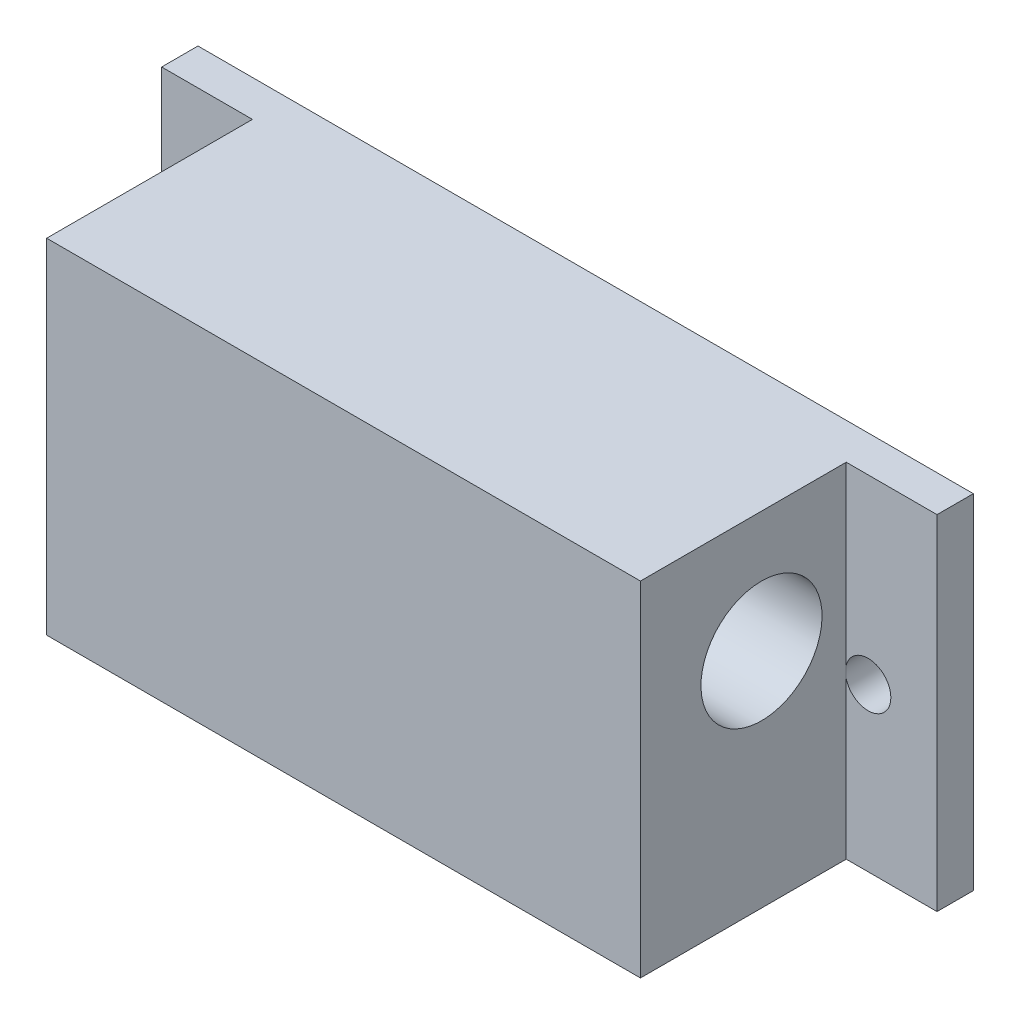
ISO-10303-21;
HEADER;
FILE_DESCRIPTION(('STEP AP214'),'2;1');
FILE_NAME('part.step','',(''),(''),'','','');
FILE_SCHEMA(('AUTOMOTIVE_DESIGN { 1 0 10303 214 1 1 1 1 }'));
ENDSEC;
DATA;
#1=APPLICATION_CONTEXT('core data for automotive mechanical design processes');
#2=APPLICATION_PROTOCOL_DEFINITION('international standard','automotive_design',2000,#1);
#3=PRODUCT_CONTEXT('',#1,'mechanical');
#4=PRODUCT('Part','Part','',(#3));
#5=PRODUCT_RELATED_PRODUCT_CATEGORY('part','',(#4));
#6=PRODUCT_DEFINITION_FORMATION('','',#4);
#7=PRODUCT_DEFINITION_CONTEXT('part definition',#1,'design');
#8=PRODUCT_DEFINITION('design','',#6,#7);
#9=PRODUCT_DEFINITION_SHAPE('','',#8);
#10=(LENGTH_UNIT() NAMED_UNIT(*) SI_UNIT(.MILLI.,.METRE.));
#11=(NAMED_UNIT(*) PLANE_ANGLE_UNIT() SI_UNIT($,.RADIAN.));
#12=(NAMED_UNIT(*) SI_UNIT($,.STERADIAN.) SOLID_ANGLE_UNIT());
#13=UNCERTAINTY_MEASURE_WITH_UNIT(LENGTH_MEASURE(1.E-05),#10,'distance_accuracy_value','');
#14=(GEOMETRIC_REPRESENTATION_CONTEXT(3) GLOBAL_UNCERTAINTY_ASSIGNED_CONTEXT((#13)) GLOBAL_UNIT_ASSIGNED_CONTEXT((#10,
#11,#12)) REPRESENTATION_CONTEXT('',''));
#15=CARTESIAN_POINT('',(0.,0.,0.));
#16=DIRECTION('',(0.,0.,1.));
#17=DIRECTION('',(1.,0.,0.));
#18=AXIS2_PLACEMENT_3D('',#15,#16,#17);
#19=CARTESIAN_POINT('',(35.9108748908686,0.,-4.445));
#20=DIRECTION('',(0.,0.,-1.));
#21=DIRECTION('',(0.,1.,0.));
#22=AXIS2_PLACEMENT_3D('',#19,#20,#21);
#23=PLANE('',#22);
#24=CARTESIAN_POINT('',(32.2970769227169,-9.52499999999999,-4.445));
#25=DIRECTION('',(0.,0.,1.));
#26=DIRECTION('',(1.,0.,0.));
#27=AXIS2_PLACEMENT_3D('',#24,#25,#26);
#28=CIRCLE('',#27,1.190625);
#29=CARTESIAN_POINT('',(31.1483748908686,-9.83816374734717,-4.445));
#30=VERTEX_POINT('',#29);
#31=CARTESIAN_POINT('',(31.1483748908686,-9.21183625265281,-4.445));
#32=VERTEX_POINT('',#31);
#33=EDGE_CURVE('E153',#30,#32,#28,.T.);
#34=ORIENTED_EDGE('',*,*,#33,.F.);
#35=DIRECTION('',(0.,-1.,0.));
#36=VECTOR('',#35,1.);
#37=CARTESIAN_POINT('',(31.1483748908686,0.,-4.445));
#38=LINE('',#37,#36);
#39=CARTESIAN_POINT('',(31.1483748908686,-18.034,-4.445));
#40=VERTEX_POINT('',#39);
#41=EDGE_CURVE('E159',#30,#40,#38,.T.);
#42=ORIENTED_EDGE('',*,*,#41,.T.);
#43=DIRECTION('',(-1.,0.,0.));
#44=VECTOR('',#43,1.);
#45=CARTESIAN_POINT('',(35.9108748908686,-18.034,-4.445));
#46=LINE('',#45,#44);
#47=CARTESIAN_POINT('',(35.9108748908686,-18.034,-4.445));
#48=VERTEX_POINT('',#47);
#49=EDGE_CURVE('E171',#48,#40,#46,.T.);
#50=ORIENTED_EDGE('',*,*,#49,.F.);
#51=DIRECTION('',(0.,-1.,0.));
#52=VECTOR('',#51,1.);
#53=CARTESIAN_POINT('',(35.9108748908686,0.,-4.445));
#54=LINE('',#53,#52);
#55=CARTESIAN_POINT('',(35.9108748908686,0.,-4.445));
#56=VERTEX_POINT('',#55);
#57=EDGE_CURVE('E166',#56,#48,#54,.T.);
#58=ORIENTED_EDGE('',*,*,#57,.F.);
#59=DIRECTION('',(-1.,0.,0.));
#60=VECTOR('',#59,1.);
#61=CARTESIAN_POINT('',(35.9108748908686,0.,-4.445));
#62=LINE('',#61,#60);
#63=CARTESIAN_POINT('',(31.1483748908686,0.,-4.445));
#64=VERTEX_POINT('',#63);
#65=EDGE_CURVE('E177',#56,#64,#62,.T.);
#66=ORIENTED_EDGE('',*,*,#65,.T.);
#67=EDGE_CURVE('E164',#64,#32,#38,.T.);
#68=ORIENTED_EDGE('',*,*,#67,.T.);
#69=EDGE_LOOP('',(#34,#42,#50,#58,#66,#68));
#70=FACE_BOUND('',#69,.T.);
#71=ADVANCED_FACE('F51',(#70),#23,.F.);
#72=CARTESIAN_POINT('',(31.1483748908686,0.,6.35));
#73=DIRECTION('',(-1.,0.,0.));
#74=DIRECTION('',(0.,-1.,0.));
#75=AXIS2_PLACEMENT_3D('',#72,#73,#74);
#76=PLANE('',#75);
#77=CARTESIAN_POINT('',(31.1483748908686,-6.35,0.));
#78=DIRECTION('',(-1.,0.,0.));
#79=DIRECTION('',(0.,-1.,0.));
#80=AXIS2_PLACEMENT_3D('',#77,#78,#79);
#81=CIRCLE('',#80,3.175);
#82=CARTESIAN_POINT('',(31.1483748908686,-3.175,0.));
#83=VERTEX_POINT('',#82);
#84=EDGE_CURVE('E195',#83,#83,#81,.T.);
#85=ORIENTED_EDGE('',*,*,#84,.T.);
#86=EDGE_LOOP('',(#85));
#87=FACE_BOUND('',#86,.T.);
#88=ORIENTED_EDGE('',*,*,#67,.F.);
#89=DIRECTION('',(0.,0.,-1.));
#90=VECTOR('',#89,1.);
#91=CARTESIAN_POINT('',(31.1483748908686,0.,6.35));
#92=LINE('',#91,#90);
#93=CARTESIAN_POINT('',(31.1483748908686,0.,6.35));
#94=VERTEX_POINT('',#93);
#95=EDGE_CURVE('E13',#94,#64,#92,.T.);
#96=ORIENTED_EDGE('',*,*,#95,.F.);
#97=DIRECTION('',(0.,1.,0.));
#98=VECTOR('',#97,1.);
#99=CARTESIAN_POINT('',(31.1483748908686,0.,6.35));
#100=LINE('',#99,#98);
#101=CARTESIAN_POINT('',(31.1483748908686,-18.034,6.35));
#102=VERTEX_POINT('',#101);
#103=EDGE_CURVE('E220',#102,#94,#100,.T.);
#104=ORIENTED_EDGE('',*,*,#103,.F.);
#105=DIRECTION('',(0.,0.,1.));
#106=VECTOR('',#105,1.);
#107=CARTESIAN_POINT('',(31.1483748908686,-18.034,6.35));
#108=LINE('',#107,#106);
#109=EDGE_CURVE('E180',#40,#102,#108,.T.);
#110=ORIENTED_EDGE('',*,*,#109,.F.);
#111=ORIENTED_EDGE('',*,*,#41,.F.);
#112=EDGE_CURVE('E174',#32,#30,#38,.T.);
#113=ORIENTED_EDGE('',*,*,#112,.F.);
#114=EDGE_LOOP('',(#88,#96,#104,#110,#111,#113));
#115=FACE_BOUND('',#114,.T.);
#116=ADVANCED_FACE('F257',(#87,#115),#76,.F.);
#117=CARTESIAN_POINT('',(0.,0.,6.35));
#118=DIRECTION('',(1.,0.,0.));
#119=DIRECTION('',(0.,1.,0.));
#120=AXIS2_PLACEMENT_3D('',#117,#118,#119);
#121=PLANE('',#120);
#122=CARTESIAN_POINT('',(0.,-6.35,0.));
#123=DIRECTION('',(-1.,0.,0.));
#124=DIRECTION('',(0.,-1.,0.));
#125=AXIS2_PLACEMENT_3D('',#122,#123,#124);
#126=CIRCLE('',#125,3.175);
#127=CARTESIAN_POINT('',(0.,-9.525,0.));
#128=VERTEX_POINT('',#127);
#129=EDGE_CURVE('E210',#128,#128,#126,.T.);
#130=ORIENTED_EDGE('',*,*,#129,.F.);
#131=EDGE_LOOP('',(#130));
#132=FACE_BOUND('',#131,.T.);
#133=DIRECTION('',(0.,0.,-1.));
#134=VECTOR('',#133,1.);
#135=CARTESIAN_POINT('',(0.,0.,6.35));
#136=LINE('',#135,#134);
#137=CARTESIAN_POINT('',(0.,0.,6.35));
#138=VERTEX_POINT('',#137);
#139=CARTESIAN_POINT('',(0.,0.,-4.445));
#140=VERTEX_POINT('',#139);
#141=EDGE_CURVE('E60',#138,#140,#136,.T.);
#142=ORIENTED_EDGE('',*,*,#141,.T.);
#143=DIRECTION('',(0.,-1.,0.));
#144=VECTOR('',#143,1.);
#145=CARTESIAN_POINT('',(0.,0.,-4.445));
#146=LINE('',#145,#144);
#147=CARTESIAN_POINT('',(0.,-9.21183625265283,-4.445));
#148=VERTEX_POINT('',#147);
#149=EDGE_CURVE('E143',#140,#148,#146,.T.);
#150=ORIENTED_EDGE('',*,*,#149,.T.);
#151=CARTESIAN_POINT('',(0.,-9.83816374734716,-4.445));
#152=VERTEX_POINT('',#151);
#153=EDGE_CURVE('E129',#148,#152,#146,.T.);
#154=ORIENTED_EDGE('',*,*,#153,.T.);
#155=CARTESIAN_POINT('',(0.,-18.034,-4.445));
#156=VERTEX_POINT('',#155);
#157=EDGE_CURVE('E74',#152,#156,#146,.T.);
#158=ORIENTED_EDGE('',*,*,#157,.T.);
#159=DIRECTION('',(0.,0.,1.));
#160=VECTOR('',#159,1.);
#161=CARTESIAN_POINT('',(0.,-18.034,6.35));
#162=LINE('',#161,#160);
#163=CARTESIAN_POINT('',(0.,-18.034,6.35));
#164=VERTEX_POINT('',#163);
#165=EDGE_CURVE('E181',#156,#164,#162,.T.);
#166=ORIENTED_EDGE('',*,*,#165,.T.);
#167=DIRECTION('',(0.,-1.,0.));
#168=VECTOR('',#167,1.);
#169=CARTESIAN_POINT('',(0.,0.,6.35));
#170=LINE('',#169,#168);
#171=EDGE_CURVE('E217',#138,#164,#170,.T.);
#172=ORIENTED_EDGE('',*,*,#171,.F.);
#173=EDGE_LOOP('',(#142,#150,#154,#158,#166,#172));
#174=FACE_BOUND('',#173,.T.);
#175=ADVANCED_FACE('F53',(#132,#174),#121,.F.);
#176=CARTESIAN_POINT('',(0.,0.,6.35));
#177=DIRECTION('',(0.,-1.,0.));
#178=DIRECTION('',(1.,0.,0.));
#179=AXIS2_PLACEMENT_3D('',#176,#177,#178);
#180=PLANE('',#179);
#181=DIRECTION('',(-1.,0.,0.));
#182=VECTOR('',#181,1.);
#183=CARTESIAN_POINT('',(0.,0.,-6.35));
#184=LINE('',#183,#182);
#185=CARTESIAN_POINT('',(35.9108748908686,0.,-6.35));
#186=VERTEX_POINT('',#185);
#187=CARTESIAN_POINT('',(-4.7625,0.,-6.35));
#188=VERTEX_POINT('',#187);
#189=EDGE_CURVE('E214',#186,#188,#184,.T.);
#190=ORIENTED_EDGE('',*,*,#189,.T.);
#191=DIRECTION('',(0.,0.,1.));
#192=VECTOR('',#191,1.);
#193=CARTESIAN_POINT('',(-4.7625,0.,-6.35));
#194=LINE('',#193,#192);
#195=CARTESIAN_POINT('',(-4.7625,0.,-4.445));
#196=VERTEX_POINT('',#195);
#197=EDGE_CURVE('E148',#188,#196,#194,.T.);
#198=ORIENTED_EDGE('',*,*,#197,.T.);
#199=DIRECTION('',(1.,0.,0.));
#200=VECTOR('',#199,1.);
#201=CARTESIAN_POINT('',(-4.7625,0.,-4.445));
#202=LINE('',#201,#200);
#203=EDGE_CURVE('E150',#196,#140,#202,.T.);
#204=ORIENTED_EDGE('',*,*,#203,.T.);
#205=ORIENTED_EDGE('',*,*,#141,.F.);
#206=DIRECTION('',(-1.,0.,0.));
#207=VECTOR('',#206,1.);
#208=CARTESIAN_POINT('',(0.,0.,6.35));
#209=LINE('',#208,#207);
#210=EDGE_CURVE('E222',#94,#138,#209,.T.);
#211=ORIENTED_EDGE('',*,*,#210,.F.);
#212=ORIENTED_EDGE('',*,*,#95,.T.);
#213=ORIENTED_EDGE('',*,*,#65,.F.);
#214=DIRECTION('',(0.,0.,1.));
#215=VECTOR('',#214,1.);
#216=CARTESIAN_POINT('',(35.9108748908686,0.,-6.35));
#217=LINE('',#216,#215);
#218=EDGE_CURVE('E163',#186,#56,#217,.T.);
#219=ORIENTED_EDGE('',*,*,#218,.F.);
#220=EDGE_LOOP('',(#190,#198,#204,#205,#211,#212,#213,#219));
#221=FACE_BOUND('',#220,.T.);
#222=ADVANCED_FACE('F229',(#221),#180,.F.);
#223=CARTESIAN_POINT('',(0.,0.,6.35));
#224=DIRECTION('',(0.,0.,1.));
#225=DIRECTION('',(1.,0.,0.));
#226=AXIS2_PLACEMENT_3D('',#223,#224,#225);
#227=PLANE('',#226);
#228=DIRECTION('',(1.,0.,0.));
#229=VECTOR('',#228,1.);
#230=CARTESIAN_POINT('',(0.,-18.034,6.35));
#231=LINE('',#230,#229);
#232=EDGE_CURVE('E185',#164,#102,#231,.T.);
#233=ORIENTED_EDGE('',*,*,#232,.T.);
#234=ORIENTED_EDGE('',*,*,#103,.T.);
#235=ORIENTED_EDGE('',*,*,#210,.T.);
#236=ORIENTED_EDGE('',*,*,#171,.T.);
#237=EDGE_LOOP('',(#233,#234,#235,#236));
#238=FACE_BOUND('',#237,.T.);
#239=ADVANCED_FACE('F313',(#238),#227,.T.);
#240=CARTESIAN_POINT('',(0.,0.,-6.35));
#241=DIRECTION('',(0.,0.,1.));
#242=DIRECTION('',(1.,0.,0.));
#243=AXIS2_PLACEMENT_3D('',#240,#241,#242);
#244=PLANE('',#243);
#245=CARTESIAN_POINT('',(-1.14870203184833,-9.52499999999999,-6.35));
#246=DIRECTION('',(0.,0.,1.));
#247=DIRECTION('',(1.,0.,0.));
#248=AXIS2_PLACEMENT_3D('',#245,#246,#247);
#249=CIRCLE('',#248,1.190625);
#250=CARTESIAN_POINT('',(0.0419229681516684,-9.52499999999999,-6.35));
#251=VERTEX_POINT('',#250);
#252=EDGE_CURVE('E137',#251,#251,#249,.T.);
#253=ORIENTED_EDGE('',*,*,#252,.T.);
#254=EDGE_LOOP('',(#253));
#255=FACE_BOUND('',#254,.T.);
#256=CARTESIAN_POINT('',(32.2970769227169,-9.52499999999999,-6.35));
#257=DIRECTION('',(0.,0.,1.));
#258=DIRECTION('',(1.,0.,0.));
#259=AXIS2_PLACEMENT_3D('',#256,#257,#258);
#260=CIRCLE('',#259,1.190625);
#261=CARTESIAN_POINT('',(33.4877019227169,-9.52499999999999,-6.35));
#262=VERTEX_POINT('',#261);
#263=EDGE_CURVE('E156',#262,#262,#260,.T.);
#264=ORIENTED_EDGE('',*,*,#263,.T.);
#265=EDGE_LOOP('',(#264));
#266=FACE_BOUND('',#265,.T.);
#267=CARTESIAN_POINT('',(15.5741874454343,-6.35,-6.35));
#268=DIRECTION('',(0.,0.,-1.));
#269=DIRECTION('',(-1.,0.,0.));
#270=AXIS2_PLACEMENT_3D('',#267,#268,#269);
#271=CIRCLE('',#270,3.175);
#272=CARTESIAN_POINT('',(12.3991874454343,-6.35,-6.35));
#273=VERTEX_POINT('',#272);
#274=EDGE_CURVE('E199',#273,#273,#271,.T.);
#275=ORIENTED_EDGE('',*,*,#274,.F.);
#276=EDGE_LOOP('',(#275));
#277=FACE_BOUND('',#276,.T.);
#278=ORIENTED_EDGE('',*,*,#189,.F.);
#279=DIRECTION('',(0.,1.,0.));
#280=VECTOR('',#279,1.);
#281=CARTESIAN_POINT('',(35.9108748908686,0.,-6.35));
#282=LINE('',#281,#280);
#283=CARTESIAN_POINT('',(35.9108748908686,-18.034,-6.35));
#284=VERTEX_POINT('',#283);
#285=EDGE_CURVE('E160',#284,#186,#282,.T.);
#286=ORIENTED_EDGE('',*,*,#285,.F.);
#287=DIRECTION('',(1.,0.,0.));
#288=VECTOR('',#287,1.);
#289=CARTESIAN_POINT('',(0.,-18.034,-6.35));
#290=LINE('',#289,#288);
#291=CARTESIAN_POINT('',(-4.7625,-18.034,-6.35));
#292=VERTEX_POINT('',#291);
#293=EDGE_CURVE('E183',#292,#284,#290,.T.);
#294=ORIENTED_EDGE('',*,*,#293,.F.);
#295=DIRECTION('',(0.,1.,0.));
#296=VECTOR('',#295,1.);
#297=CARTESIAN_POINT('',(-4.7625,0.,-6.35));
#298=LINE('',#297,#296);
#299=EDGE_CURVE('E145',#292,#188,#298,.T.);
#300=ORIENTED_EDGE('',*,*,#299,.T.);
#301=EDGE_LOOP('',(#278,#286,#294,#300));
#302=FACE_BOUND('',#301,.T.);
#303=ADVANCED_FACE('F247',(#255,#266,#277,#302),#244,.F.);
#304=CARTESIAN_POINT('',(9.525,-6.35,0.));
#305=DIRECTION('',(-1.,0.,0.));
#306=DIRECTION('',(0.,-1.,0.));
#307=AXIS2_PLACEMENT_3D('',#304,#305,#306);
#308=CYLINDRICAL_SURFACE('',#307,3.175);
#309=CARTESIAN_POINT('',(9.525,-6.35,0.));
#310=DIRECTION('',(-1.,0.,0.));
#311=DIRECTION('',(0.,-1.,0.));
#312=AXIS2_PLACEMENT_3D('',#309,#310,#311);
#313=CIRCLE('',#312,3.175);
#314=CARTESIAN_POINT('',(9.525,-9.525,0.));
#315=VERTEX_POINT('',#314);
#316=EDGE_CURVE('E211',#315,#315,#313,.T.);
#317=CARTESIAN_POINT('',(9.525,-9.525,0.));
#318=CARTESIAN_POINT('',(9.42578125,-9.525,0.));
#319=CARTESIAN_POINT('',(9.3265625,-9.525,0.));
#320=CARTESIAN_POINT('',(9.128125,-9.525,0.));
#321=CARTESIAN_POINT('',(9.02890625,-9.525,0.));
#322=CARTESIAN_POINT('',(8.83046875,-9.525,0.));
#323=CARTESIAN_POINT('',(8.73125,-9.525,0.));
#324=CARTESIAN_POINT('',(8.5328125,-9.525,0.));
#325=CARTESIAN_POINT('',(8.43359375,-9.525,0.));
#326=CARTESIAN_POINT('',(8.23515625,-9.525,0.));
#327=CARTESIAN_POINT('',(8.1359375,-9.525,0.));
#328=CARTESIAN_POINT('',(7.9375,-9.525,0.));
#329=CARTESIAN_POINT('',(7.83828125,-9.525,0.));
#330=CARTESIAN_POINT('',(7.63984375,-9.525,0.));
#331=CARTESIAN_POINT('',(7.540625,-9.525,0.));
#332=CARTESIAN_POINT('',(7.3421875,-9.525,0.));
#333=CARTESIAN_POINT('',(7.24296875,-9.525,0.));
#334=CARTESIAN_POINT('',(7.04453125,-9.525,0.));
#335=CARTESIAN_POINT('',(6.9453125,-9.525,0.));
#336=CARTESIAN_POINT('',(6.746875,-9.525,0.));
#337=CARTESIAN_POINT('',(6.64765625,-9.525,0.));
#338=CARTESIAN_POINT('',(6.44921875,-9.525,0.));
#339=CARTESIAN_POINT('',(6.35,-9.525,0.));
#340=CARTESIAN_POINT('',(6.1515625,-9.525,0.));
#341=CARTESIAN_POINT('',(6.05234375,-9.525,0.));
#342=CARTESIAN_POINT('',(5.85390625,-9.525,0.));
#343=CARTESIAN_POINT('',(5.7546875,-9.525,0.));
#344=CARTESIAN_POINT('',(5.55625,-9.525,0.));
#345=CARTESIAN_POINT('',(5.45703125,-9.525,0.));
#346=CARTESIAN_POINT('',(5.25859375,-9.525,0.));
#347=CARTESIAN_POINT('',(5.159375,-9.525,0.));
#348=CARTESIAN_POINT('',(4.9609375,-9.525,0.));
#349=CARTESIAN_POINT('',(4.86171875,-9.525,0.));
#350=CARTESIAN_POINT('',(4.66328125,-9.525,0.));
#351=CARTESIAN_POINT('',(4.5640625,-9.525,0.));
#352=CARTESIAN_POINT('',(4.365625,-9.525,0.));
#353=CARTESIAN_POINT('',(4.26640625,-9.525,0.));
#354=CARTESIAN_POINT('',(4.06796875,-9.525,0.));
#355=CARTESIAN_POINT('',(3.96875,-9.525,0.));
#356=CARTESIAN_POINT('',(3.7703125,-9.525,0.));
#357=CARTESIAN_POINT('',(3.67109375,-9.525,0.));
#358=CARTESIAN_POINT('',(3.47265625,-9.525,0.));
#359=CARTESIAN_POINT('',(3.3734375,-9.525,0.));
#360=CARTESIAN_POINT('',(3.175,-9.525,0.));
#361=CARTESIAN_POINT('',(3.07578125,-9.525,0.));
#362=CARTESIAN_POINT('',(2.87734375,-9.525,0.));
#363=CARTESIAN_POINT('',(2.778125,-9.525,0.));
#364=CARTESIAN_POINT('',(2.5796875,-9.525,0.));
#365=CARTESIAN_POINT('',(2.48046875,-9.525,0.));
#366=CARTESIAN_POINT('',(2.28203125,-9.525,0.));
#367=CARTESIAN_POINT('',(2.1828125,-9.525,0.));
#368=CARTESIAN_POINT('',(1.984375,-9.525,0.));
#369=CARTESIAN_POINT('',(1.88515625,-9.525,0.));
#370=CARTESIAN_POINT('',(1.68671875,-9.525,0.));
#371=CARTESIAN_POINT('',(1.5875,-9.525,0.));
#372=CARTESIAN_POINT('',(1.3890625,-9.525,0.));
#373=CARTESIAN_POINT('',(1.28984375,-9.525,0.));
#374=CARTESIAN_POINT('',(1.09140625,-9.525,0.));
#375=CARTESIAN_POINT('',(0.992187500000001,-9.525,0.));
#376=CARTESIAN_POINT('',(0.793750000000001,-9.525,0.));
#377=CARTESIAN_POINT('',(0.69453125,-9.525,0.));
#378=CARTESIAN_POINT('',(0.49609375,-9.525,0.));
#379=CARTESIAN_POINT('',(0.396875,-9.525,0.));
#380=CARTESIAN_POINT('',(0.1984375,-9.525,0.));
#381=CARTESIAN_POINT('',(0.0992187500000001,-9.525,0.));
#382=CARTESIAN_POINT('',(0.,-9.525,0.));
#383=B_SPLINE_CURVE_WITH_KNOTS('',3,(#317,#318,#319,#320,#321,#322,#323,#324,#325,#326,#327,
#328,#329,#330,#331,#332,#333,#334,#335,#336,#337,#338,#339,#340,#341,#342,#343,#344,#345,#346,
#347,#348,#349,#350,#351,#352,#353,#354,#355,#356,#357,#358,#359,#360,#361,#362,#363,#364,#365,
#366,#367,#368,#369,#370,#371,#372,#373,#374,#375,#376,#377,#378,#379,#380,#381,#382),
.UNSPECIFIED.,.F.,.F.,(4,2,2,2,2,2,2,2,2,2,2,2,2,2,2,2,2,2,2,2,2,2,2,2,2,2,2,2,2,2,2,2,4),(0.,
0.297656249999998,0.595312499999999,0.892968749999999,1.190625,1.48828125,1.7859375,2.08359375,
2.38125,2.67890625,2.9765625,3.27421875,3.571875,3.86953125,4.1671875,4.46484375,4.7625,
5.06015625,5.3578125,5.65546875,5.953125,6.25078125,6.5484375,6.84609375,7.14375,7.44140625,
7.7390625,8.03671875,8.334375,8.63203125,8.9296875,9.22734375,9.525),.UNSPECIFIED.);
#384=EDGE_CURVE('BSEAM308',#315,#128,#383,.T.);
#385=ORIENTED_EDGE('',*,*,#316,.F.);
#386=ORIENTED_EDGE('',*,*,#129,.T.);
#387=ORIENTED_EDGE('',*,*,#384,.T.);
#388=ORIENTED_EDGE('',*,*,#384,.F.);
#389=EDGE_LOOP('',(#385,#387,#386,#388));
#390=FACE_BOUND('',#389,.T.);
#391=ADVANCED_FACE('F308',(#390),#308,.F.);
#392=CARTESIAN_POINT('',(9.525,-6.35,0.));
#393=DIRECTION('',(-1.,0.,0.));
#394=DIRECTION('',(0.,-1.,0.));
#395=AXIS2_PLACEMENT_3D('',#392,#393,#394);
#396=PLANE('',#395);
#397=ORIENTED_EDGE('',*,*,#316,.T.);
#398=EDGE_LOOP('',(#397));
#399=FACE_BOUND('',#398,.T.);
#400=ADVANCED_FACE('F298',(#399),#396,.T.);
#401=CARTESIAN_POINT('',(15.5741874454343,-6.35,3.175));
#402=DIRECTION('',(0.,0.,-1.));
#403=DIRECTION('',(-1.,0.,0.));
#404=AXIS2_PLACEMENT_3D('',#401,#402,#403);
#405=CYLINDRICAL_SURFACE('',#404,3.175);
#406=CARTESIAN_POINT('',(15.5741874454343,-6.35,3.175));
#407=DIRECTION('',(0.,0.,-1.));
#408=DIRECTION('',(-1.,0.,0.));
#409=AXIS2_PLACEMENT_3D('',#406,#407,#408);
#410=CIRCLE('',#409,3.175);
#411=CARTESIAN_POINT('',(12.3991874454343,-6.35,3.175));
#412=VERTEX_POINT('',#411);
#413=EDGE_CURVE('E202',#412,#412,#410,.T.);
#414=CARTESIAN_POINT('',(12.3991874454343,-6.35,3.175));
#415=CARTESIAN_POINT('',(12.3991874454343,-6.35,3.07578125));
#416=CARTESIAN_POINT('',(12.3991874454343,-6.35,2.9765625));
#417=CARTESIAN_POINT('',(12.3991874454343,-6.35,2.778125));
#418=CARTESIAN_POINT('',(12.3991874454343,-6.35,2.67890625));
#419=CARTESIAN_POINT('',(12.3991874454343,-6.35,2.48046875));
#420=CARTESIAN_POINT('',(12.3991874454343,-6.35,2.38125));
#421=CARTESIAN_POINT('',(12.3991874454343,-6.35,2.1828125));
#422=CARTESIAN_POINT('',(12.3991874454343,-6.35,2.08359375));
#423=CARTESIAN_POINT('',(12.3991874454343,-6.35,1.88515625));
#424=CARTESIAN_POINT('',(12.3991874454343,-6.35,1.7859375));
#425=CARTESIAN_POINT('',(12.3991874454343,-6.35,1.5875));
#426=CARTESIAN_POINT('',(12.3991874454343,-6.35,1.48828125));
#427=CARTESIAN_POINT('',(12.3991874454343,-6.35,1.28984375));
#428=CARTESIAN_POINT('',(12.3991874454343,-6.35,1.190625));
#429=CARTESIAN_POINT('',(12.3991874454343,-6.35,0.992187500000001));
#430=CARTESIAN_POINT('',(12.3991874454343,-6.35,0.892968750000001));
#431=CARTESIAN_POINT('',(12.3991874454343,-6.35,0.694531250000001));
#432=CARTESIAN_POINT('',(12.3991874454343,-6.35,0.5953125));
#433=CARTESIAN_POINT('',(12.3991874454343,-6.35,0.396875));
#434=CARTESIAN_POINT('',(12.3991874454343,-6.35,0.29765625));
#435=CARTESIAN_POINT('',(12.3991874454343,-6.35,0.0992187500000004));
#436=CARTESIAN_POINT('',(12.3991874454343,-6.35,0.));
#437=CARTESIAN_POINT('',(12.3991874454343,-6.35,-0.1984375));
#438=CARTESIAN_POINT('',(12.3991874454343,-6.35,-0.29765625));
#439=CARTESIAN_POINT('',(12.3991874454343,-6.35,-0.49609375));
#440=CARTESIAN_POINT('',(12.3991874454343,-6.35,-0.5953125));
#441=CARTESIAN_POINT('',(12.3991874454343,-6.35,-0.79375));
#442=CARTESIAN_POINT('',(12.3991874454343,-6.35,-0.892968749999999));
#443=CARTESIAN_POINT('',(12.3991874454343,-6.35,-1.09140625));
#444=CARTESIAN_POINT('',(12.3991874454343,-6.35,-1.190625));
#445=CARTESIAN_POINT('',(12.3991874454343,-6.35,-1.3890625));
#446=CARTESIAN_POINT('',(12.3991874454343,-6.35,-1.48828125));
#447=CARTESIAN_POINT('',(12.3991874454343,-6.35,-1.68671875));
#448=CARTESIAN_POINT('',(12.3991874454343,-6.35,-1.7859375));
#449=CARTESIAN_POINT('',(12.3991874454343,-6.35,-1.984375));
#450=CARTESIAN_POINT('',(12.3991874454343,-6.35,-2.08359375));
#451=CARTESIAN_POINT('',(12.3991874454343,-6.35,-2.28203125));
#452=CARTESIAN_POINT('',(12.3991874454343,-6.35,-2.38125));
#453=CARTESIAN_POINT('',(12.3991874454343,-6.35,-2.5796875));
#454=CARTESIAN_POINT('',(12.3991874454343,-6.35,-2.67890625));
#455=CARTESIAN_POINT('',(12.3991874454343,-6.35,-2.87734375));
#456=CARTESIAN_POINT('',(12.3991874454343,-6.35,-2.9765625));
#457=CARTESIAN_POINT('',(12.3991874454343,-6.35,-3.175));
#458=CARTESIAN_POINT('',(12.3991874454343,-6.35,-3.27421875));
#459=CARTESIAN_POINT('',(12.3991874454343,-6.35,-3.47265625));
#460=CARTESIAN_POINT('',(12.3991874454343,-6.35,-3.571875));
#461=CARTESIAN_POINT('',(12.3991874454343,-6.35,-3.7703125));
#462=CARTESIAN_POINT('',(12.3991874454343,-6.35,-3.86953125));
#463=CARTESIAN_POINT('',(12.3991874454343,-6.35,-4.06796875));
#464=CARTESIAN_POINT('',(12.3991874454343,-6.35,-4.1671875));
#465=CARTESIAN_POINT('',(12.3991874454343,-6.35,-4.365625));
#466=CARTESIAN_POINT('',(12.3991874454343,-6.35,-4.46484375));
#467=CARTESIAN_POINT('',(12.3991874454343,-6.35,-4.66328125));
#468=CARTESIAN_POINT('',(12.3991874454343,-6.35,-4.7625));
#469=CARTESIAN_POINT('',(12.3991874454343,-6.35,-4.9609375));
#470=CARTESIAN_POINT('',(12.3991874454343,-6.35,-5.06015625));
#471=CARTESIAN_POINT('',(12.3991874454343,-6.35,-5.25859375));
#472=CARTESIAN_POINT('',(12.3991874454343,-6.35,-5.3578125));
#473=CARTESIAN_POINT('',(12.3991874454343,-6.35,-5.55625));
#474=CARTESIAN_POINT('',(12.3991874454343,-6.35,-5.65546875));
#475=CARTESIAN_POINT('',(12.3991874454343,-6.35,-5.85390625));
#476=CARTESIAN_POINT('',(12.3991874454343,-6.35,-5.953125));
#477=CARTESIAN_POINT('',(12.3991874454343,-6.35,-6.1515625));
#478=CARTESIAN_POINT('',(12.3991874454343,-6.35,-6.25078125));
#479=CARTESIAN_POINT('',(12.3991874454343,-6.35,-6.35));
#480=B_SPLINE_CURVE_WITH_KNOTS('',3,(#414,#415,#416,#417,#418,#419,#420,#421,#422,#423,#424,
#425,#426,#427,#428,#429,#430,#431,#432,#433,#434,#435,#436,#437,#438,#439,#440,#441,#442,#443,
#444,#445,#446,#447,#448,#449,#450,#451,#452,#453,#454,#455,#456,#457,#458,#459,#460,#461,#462,
#463,#464,#465,#466,#467,#468,#469,#470,#471,#472,#473,#474,#475,#476,#477,#478,#479),
.UNSPECIFIED.,.F.,.F.,(4,2,2,2,2,2,2,2,2,2,2,2,2,2,2,2,2,2,2,2,2,2,2,2,2,2,2,2,2,2,2,2,4),(0.,
0.29765625,0.5953125,0.89296875,1.190625,1.48828125,1.7859375,2.08359375,2.38125,2.67890625,
2.9765625,3.27421875,3.571875,3.86953125,4.1671875,4.46484375,4.7625,5.06015625,5.3578125,
5.65546875,5.953125,6.25078125,6.5484375,6.84609375,7.14375,7.44140625,7.7390625,8.03671875,
8.334375,8.63203125,8.9296875,9.22734375,9.525),.UNSPECIFIED.);
#481=EDGE_CURVE('BSEAM294',#412,#273,#480,.T.);
#482=ORIENTED_EDGE('',*,*,#413,.F.);
#483=ORIENTED_EDGE('',*,*,#274,.T.);
#484=ORIENTED_EDGE('',*,*,#481,.T.);
#485=ORIENTED_EDGE('',*,*,#481,.F.);
#486=EDGE_LOOP('',(#482,#484,#483,#485));
#487=FACE_BOUND('',#486,.T.);
#488=ADVANCED_FACE('F294',(#487),#405,.F.);
#489=CARTESIAN_POINT('',(15.5741874454343,-6.35,3.175));
#490=DIRECTION('',(0.,0.,-1.));
#491=DIRECTION('',(-1.,0.,0.));
#492=AXIS2_PLACEMENT_3D('',#489,#490,#491);
#493=PLANE('',#492);
#494=ORIENTED_EDGE('',*,*,#413,.T.);
#495=EDGE_LOOP('',(#494));
#496=FACE_BOUND('',#495,.T.);
#497=ADVANCED_FACE('F290',(#496),#493,.T.);
#498=CARTESIAN_POINT('',(21.6233748908686,-6.35,0.));
#499=DIRECTION('',(1.,0.,0.));
#500=DIRECTION('',(0.,1.,0.));
#501=AXIS2_PLACEMENT_3D('',#498,#499,#500);
#502=CYLINDRICAL_SURFACE('',#501,3.175);
#503=CARTESIAN_POINT('',(21.6233748908686,-6.35,0.));
#504=DIRECTION('',(-1.,0.,0.));
#505=DIRECTION('',(0.,-1.,0.));
#506=AXIS2_PLACEMENT_3D('',#503,#504,#505);
#507=CIRCLE('',#506,3.175);
#508=CARTESIAN_POINT('',(21.6233748908686,-3.175,0.));
#509=VERTEX_POINT('',#508);
#510=EDGE_CURVE('E196',#509,#509,#507,.T.);
#511=CARTESIAN_POINT('',(21.6233748908686,-3.175,0.));
#512=CARTESIAN_POINT('',(21.7225936408686,-3.175,0.));
#513=CARTESIAN_POINT('',(21.8218123908685,-3.175,0.));
#514=CARTESIAN_POINT('',(22.0202498908686,-3.175,0.));
#515=CARTESIAN_POINT('',(22.1194686408686,-3.175,0.));
#516=CARTESIAN_POINT('',(22.3179061408686,-3.175,0.));
#517=CARTESIAN_POINT('',(22.4171248908685,-3.175,0.));
#518=CARTESIAN_POINT('',(22.6155623908686,-3.175,0.));
#519=CARTESIAN_POINT('',(22.7147811408685,-3.175,0.));
#520=CARTESIAN_POINT('',(22.9132186408686,-3.175,0.));
#521=CARTESIAN_POINT('',(23.0124373908685,-3.175,0.));
#522=CARTESIAN_POINT('',(23.2108748908686,-3.175,0.));
#523=CARTESIAN_POINT('',(23.3100936408686,-3.175,0.));
#524=CARTESIAN_POINT('',(23.5085311408686,-3.175,0.));
#525=CARTESIAN_POINT('',(23.6077498908686,-3.175,0.));
#526=CARTESIAN_POINT('',(23.8061873908686,-3.175,0.));
#527=CARTESIAN_POINT('',(23.9054061408685,-3.175,0.));
#528=CARTESIAN_POINT('',(24.1038436408686,-3.175,0.));
#529=CARTESIAN_POINT('',(24.2030623908685,-3.175,0.));
#530=CARTESIAN_POINT('',(24.4014998908686,-3.175,0.));
#531=CARTESIAN_POINT('',(24.5007186408686,-3.175,0.));
#532=CARTESIAN_POINT('',(24.6991561408686,-3.175,0.));
#533=CARTESIAN_POINT('',(24.7983748908686,-3.175,0.));
#534=CARTESIAN_POINT('',(24.9968123908686,-3.175,0.));
#535=CARTESIAN_POINT('',(25.0960311408686,-3.175,0.));
#536=CARTESIAN_POINT('',(25.2944686408686,-3.175,0.));
#537=CARTESIAN_POINT('',(25.3936873908685,-3.175,0.));
#538=CARTESIAN_POINT('',(25.5921248908686,-3.175,0.));
#539=CARTESIAN_POINT('',(25.6913436408686,-3.175,0.));
#540=CARTESIAN_POINT('',(25.8897811408685,-3.175,0.));
#541=CARTESIAN_POINT('',(25.9889998908685,-3.175,0.));
#542=CARTESIAN_POINT('',(26.1874373908685,-3.175,0.));
#543=CARTESIAN_POINT('',(26.2866561408685,-3.175,0.));
#544=CARTESIAN_POINT('',(26.4850936408686,-3.175,0.));
#545=CARTESIAN_POINT('',(26.5843123908685,-3.175,0.));
#546=CARTESIAN_POINT('',(26.7827498908686,-3.175,0.));
#547=CARTESIAN_POINT('',(26.8819686408685,-3.175,0.));
#548=CARTESIAN_POINT('',(27.0804061408686,-3.175,0.));
#549=CARTESIAN_POINT('',(27.1796248908685,-3.175,0.));
#550=CARTESIAN_POINT('',(27.3780623908685,-3.175,0.));
#551=CARTESIAN_POINT('',(27.4772811408685,-3.175,0.));
#552=CARTESIAN_POINT('',(27.6757186408686,-3.175,0.));
#553=CARTESIAN_POINT('',(27.7749373908685,-3.175,0.));
#554=CARTESIAN_POINT('',(27.9733748908686,-3.175,0.));
#555=CARTESIAN_POINT('',(28.0725936408686,-3.175,0.));
#556=CARTESIAN_POINT('',(28.2710311408686,-3.175,0.));
#557=CARTESIAN_POINT('',(28.3702498908685,-3.175,0.));
#558=CARTESIAN_POINT('',(28.5686873908686,-3.175,0.));
#559=CARTESIAN_POINT('',(28.6679061408685,-3.175,0.));
#560=CARTESIAN_POINT('',(28.8663436408686,-3.175,0.));
#561=CARTESIAN_POINT('',(28.9655623908685,-3.175,0.));
#562=CARTESIAN_POINT('',(29.1639998908686,-3.175,0.));
#563=CARTESIAN_POINT('',(29.2632186408686,-3.175,0.));
#564=CARTESIAN_POINT('',(29.4616561408686,-3.175,0.));
#565=CARTESIAN_POINT('',(29.5608748908686,-3.175,0.));
#566=CARTESIAN_POINT('',(29.7593123908686,-3.175,0.));
#567=CARTESIAN_POINT('',(29.8585311408685,-3.175,0.));
#568=CARTESIAN_POINT('',(30.0569686408686,-3.175,0.));
#569=CARTESIAN_POINT('',(30.1561873908685,-3.175,0.));
#570=CARTESIAN_POINT('',(30.3546248908686,-3.175,0.));
#571=CARTESIAN_POINT('',(30.4538436408686,-3.175,0.));
#572=CARTESIAN_POINT('',(30.6522811408686,-3.175,0.));
#573=CARTESIAN_POINT('',(30.7514998908686,-3.175,0.));
#574=CARTESIAN_POINT('',(30.9499373908686,-3.175,0.));
#575=CARTESIAN_POINT('',(31.0491561408686,-3.175,0.));
#576=CARTESIAN_POINT('',(31.1483748908686,-3.175,0.));
#577=B_SPLINE_CURVE_WITH_KNOTS('',3,(#511,#512,#513,#514,#515,#516,#517,#518,#519,#520,#521,
#522,#523,#524,#525,#526,#527,#528,#529,#530,#531,#532,#533,#534,#535,#536,#537,#538,#539,#540,
#541,#542,#543,#544,#545,#546,#547,#548,#549,#550,#551,#552,#553,#554,#555,#556,#557,#558,#559,
#560,#561,#562,#563,#564,#565,#566,#567,#568,#569,#570,#571,#572,#573,#574,#575,#576),
.UNSPECIFIED.,.F.,.F.,(4,2,2,2,2,2,2,2,2,2,2,2,2,2,2,2,2,2,2,2,2,2,2,2,2,2,2,2,2,2,2,2,4),(0.,
0.29765625,0.5953125,0.892968750000001,1.190625,1.48828125,1.7859375,2.08359375,2.38125,
2.67890625,2.9765625,3.27421875,3.571875,3.86953125,4.1671875,4.46484375,4.7625,5.06015625,
5.3578125,5.65546875,5.953125,6.25078125,6.5484375,6.84609375,7.14375,7.44140625,7.7390625,
8.03671875,8.334375,8.63203125,8.9296875,9.22734375,9.525),.UNSPECIFIED.);
#578=EDGE_CURVE('BSEAM286',#509,#83,#577,.T.);
#579=ORIENTED_EDGE('',*,*,#510,.T.);
#580=ORIENTED_EDGE('',*,*,#84,.F.);
#581=ORIENTED_EDGE('',*,*,#578,.T.);
#582=ORIENTED_EDGE('',*,*,#578,.F.);
#583=EDGE_LOOP('',(#579,#581,#580,#582));
#584=FACE_BOUND('',#583,.T.);
#585=ADVANCED_FACE('F286',(#584),#502,.F.);
#586=CARTESIAN_POINT('',(21.6233748908686,-6.35,0.));
#587=DIRECTION('',(1.,0.,0.));
#588=DIRECTION('',(0.,-1.,0.));
#589=AXIS2_PLACEMENT_3D('',#586,#587,#588);
#590=PLANE('',#589);
#591=ORIENTED_EDGE('',*,*,#510,.F.);
#592=EDGE_LOOP('',(#591));
#593=FACE_BOUND('',#592,.T.);
#594=ADVANCED_FACE('F273',(#593),#590,.T.);
#595=CARTESIAN_POINT('',(0.,-18.034,6.35));
#596=DIRECTION('',(0.,1.,0.));
#597=DIRECTION('',(-1.,0.,0.));
#598=AXIS2_PLACEMENT_3D('',#595,#596,#597);
#599=PLANE('',#598);
#600=CARTESIAN_POINT('',(8.82842690022267,-18.034,0.));
#601=DIRECTION('',(0.,1.,0.));
#602=DIRECTION('',(1.,0.,0.));
#603=AXIS2_PLACEMENT_3D('',#600,#601,#602);
#604=ELLIPSE('',#603,3.66617420935413,3.175);
#605=CARTESIAN_POINT('',(12.4946011095768,-18.034,0.));
#606=VERTEX_POINT('',#605);
#607=EDGE_CURVE('E189',#606,#606,#604,.T.);
#608=ORIENTED_EDGE('',*,*,#607,.T.);
#609=EDGE_LOOP('',(#608));
#610=FACE_BOUND('',#609,.T.);
#611=ORIENTED_EDGE('',*,*,#293,.T.);
#612=DIRECTION('',(0.,0.,-1.));
#613=VECTOR('',#612,1.);
#614=CARTESIAN_POINT('',(35.9108748908686,-18.034,-6.35));
#615=LINE('',#614,#613);
#616=EDGE_CURVE('E168',#48,#284,#615,.T.);
#617=ORIENTED_EDGE('',*,*,#616,.F.);
#618=ORIENTED_EDGE('',*,*,#49,.T.);
#619=ORIENTED_EDGE('',*,*,#109,.T.);
#620=ORIENTED_EDGE('',*,*,#232,.F.);
#621=ORIENTED_EDGE('',*,*,#165,.F.);
#622=DIRECTION('',(1.,0.,0.));
#623=VECTOR('',#622,1.);
#624=CARTESIAN_POINT('',(-4.7625,-18.034,-4.445));
#625=LINE('',#624,#623);
#626=CARTESIAN_POINT('',(-4.7625,-18.034,-4.445));
#627=VERTEX_POINT('',#626);
#628=EDGE_CURVE('E140',#627,#156,#625,.T.);
#629=ORIENTED_EDGE('',*,*,#628,.F.);
#630=DIRECTION('',(0.,0.,-1.));
#631=VECTOR('',#630,1.);
#632=CARTESIAN_POINT('',(-4.7625,-18.034,-6.35));
#633=LINE('',#632,#631);
#634=EDGE_CURVE('E239',#627,#292,#633,.T.);
#635=ORIENTED_EDGE('',*,*,#634,.T.);
#636=EDGE_LOOP('',(#611,#617,#618,#619,#620,#621,#629,#635));
#637=FACE_BOUND('',#636,.T.);
#638=CARTESIAN_POINT('',(22.3199479906459,-18.034,0.));
#639=DIRECTION('',(0.,1.,0.));
#640=DIRECTION('',(-1.,0.,0.));
#641=AXIS2_PLACEMENT_3D('',#638,#639,#640);
#642=ELLIPSE('',#641,3.66617420935412,3.175);
#643=CARTESIAN_POINT('',(18.6537737812918,-18.034,0.));
#644=VERTEX_POINT('',#643);
#645=EDGE_CURVE('E55',#644,#644,#642,.F.);
#646=ORIENTED_EDGE('',*,*,#645,.F.);
#647=EDGE_LOOP('',(#646));
#648=FACE_BOUND('',#647,.T.);
#649=ADVANCED_FACE('F269',(#610,#637,#648),#599,.F.);
#650=CARTESIAN_POINT('',(12.5495937227171,-11.58875,0.));
#651=DIRECTION('',(-0.500000000000001,-0.866025403784438,0.));
#652=DIRECTION('',(0.866025403784438,-0.500000000000001,0.));
#653=AXIS2_PLACEMENT_3D('',#650,#651,#652);
#654=PLANE('',#653);
#655=CARTESIAN_POINT('',(12.5495937227171,-11.58875,0.));
#656=DIRECTION('',(-0.500000000000001,-0.866025403784438,0.));
#657=DIRECTION('',(0.866025403784438,-0.500000000000001,0.));
#658=AXIS2_PLACEMENT_3D('',#655,#656,#657);
#659=CIRCLE('',#658,3.175);
#660=CARTESIAN_POINT('',(15.2992243797327,-13.17625,0.));
#661=VERTEX_POINT('',#660);
#662=EDGE_CURVE('E205',#661,#661,#659,.T.);
#663=ORIENTED_EDGE('',*,*,#662,.T.);
#664=EDGE_LOOP('',(#663));
#665=FACE_BOUND('',#664,.T.);
#666=ADVANCED_FACE('F272',(#665),#654,.T.);
#667=CARTESIAN_POINT('',(5.83963727933594,-23.2107354765103,0.));
#668=DIRECTION('',(0.500000000000001,0.866025403784438,0.));
#669=DIRECTION('',(-0.866025403784438,0.500000000000001,0.));
#670=AXIS2_PLACEMENT_3D('',#667,#668,#669);
#671=CYLINDRICAL_SURFACE('',#670,3.175);
#672=ORIENTED_EDGE('',*,*,#607,.F.);
#673=EDGE_LOOP('',(#672));
#674=FACE_BOUND('',#673,.T.);
#675=ORIENTED_EDGE('',*,*,#662,.F.);
#676=EDGE_LOOP('',(#675));
#677=FACE_BOUND('',#676,.T.);
#678=ADVANCED_FACE('F279',(#674,#677),#671,.F.);
#679=CARTESIAN_POINT('',(18.5987811681514,-11.58875,0.));
#680=DIRECTION('',(0.500000000000001,-0.866025403784438,0.));
#681=DIRECTION('',(-0.866025403784438,-0.500000000000001,0.));
#682=AXIS2_PLACEMENT_3D('',#679,#680,#681);
#683=PLANE('',#682);
#684=CARTESIAN_POINT('',(18.5987811681514,-11.58875,0.));
#685=DIRECTION('',(-0.500000000000001,0.866025403784438,0.));
#686=DIRECTION('',(-0.866025403784438,-0.500000000000001,0.));
#687=AXIS2_PLACEMENT_3D('',#684,#685,#686);
#688=CIRCLE('',#687,3.175);
#689=CARTESIAN_POINT('',(15.8491505111358,-13.17625,0.));
#690=VERTEX_POINT('',#689);
#691=EDGE_CURVE('E192',#690,#690,#688,.T.);
#692=ORIENTED_EDGE('',*,*,#691,.F.);
#693=EDGE_LOOP('',(#692));
#694=FACE_BOUND('',#693,.T.);
#695=ADVANCED_FACE('F275',(#694),#683,.T.);
#696=CARTESIAN_POINT('',(25.3087376115326,-23.2107354765103,0.));
#697=DIRECTION('',(-0.500000000000001,0.866025403784438,0.));
#698=DIRECTION('',(-0.866025403784438,-0.500000000000001,0.));
#699=AXIS2_PLACEMENT_3D('',#696,#697,#698);
#700=CYLINDRICAL_SURFACE('',#699,3.175);
#701=ORIENTED_EDGE('',*,*,#645,.T.);
#702=EDGE_LOOP('',(#701));
#703=FACE_BOUND('',#702,.T.);
#704=ORIENTED_EDGE('',*,*,#691,.T.);
#705=EDGE_LOOP('',(#704));
#706=FACE_BOUND('',#705,.T.);
#707=ADVANCED_FACE('F278',(#703,#706),#700,.F.);
#708=CARTESIAN_POINT('',(35.9108748908686,0.,0.));
#709=DIRECTION('',(-1.,0.,0.));
#710=DIRECTION('',(0.,-1.,0.));
#711=AXIS2_PLACEMENT_3D('',#708,#709,#710);
#712=PLANE('',#711);
#713=ORIENTED_EDGE('',*,*,#285,.T.);
#714=ORIENTED_EDGE('',*,*,#218,.T.);
#715=ORIENTED_EDGE('',*,*,#57,.T.);
#716=ORIENTED_EDGE('',*,*,#616,.T.);
#717=EDGE_LOOP('',(#713,#714,#715,#716));
#718=FACE_BOUND('',#717,.T.);
#719=ADVANCED_FACE('F267',(#718),#712,.F.);
#720=CARTESIAN_POINT('',(33.4877019227169,-9.52499999999999,-4.445));
#721=DIRECTION('',(0.,0.,1.));
#722=DIRECTION('',(1.,0.,0.));
#723=AXIS2_PLACEMENT_3D('',#720,#721,#722);
#724=PLANE('',#723);
#725=ORIENTED_EDGE('',*,*,#112,.T.);
#726=EDGE_CURVE('E154',#32,#30,#28,.T.);
#727=ORIENTED_EDGE('',*,*,#726,.F.);
#728=EDGE_LOOP('',(#725,#727));
#729=FACE_BOUND('',#728,.T.);
#730=ADVANCED_FACE('F343',(#729),#724,.F.);
#731=CARTESIAN_POINT('',(32.2970769227169,-9.52499999999999,-4.445));
#732=DIRECTION('',(0.,0.,1.));
#733=DIRECTION('',(1.,0.,0.));
#734=AXIS2_PLACEMENT_3D('',#731,#732,#733);
#735=CYLINDRICAL_SURFACE('',#734,1.190625);
#736=ORIENTED_EDGE('',*,*,#263,.F.);
#737=EDGE_LOOP('',(#736));
#738=FACE_BOUND('',#737,.T.);
#739=ORIENTED_EDGE('',*,*,#726,.T.);
#740=ORIENTED_EDGE('',*,*,#33,.T.);
#741=EDGE_LOOP('',(#739,#740));
#742=FACE_BOUND('',#741,.T.);
#743=ADVANCED_FACE('F347',(#738,#742),#735,.F.);
#744=CARTESIAN_POINT('',(-4.7625,0.,-4.445));
#745=DIRECTION('',(0.,0.,1.));
#746=DIRECTION('',(0.,-1.,0.));
#747=AXIS2_PLACEMENT_3D('',#744,#745,#746);
#748=PLANE('',#747);
#749=CARTESIAN_POINT('',(-1.14870203184833,-9.52499999999999,-4.445));
#750=DIRECTION('',(0.,0.,1.));
#751=DIRECTION('',(1.,0.,0.));
#752=AXIS2_PLACEMENT_3D('',#749,#750,#751);
#753=CIRCLE('',#752,1.190625);
#754=EDGE_CURVE('E131',#148,#152,#753,.T.);
#755=ORIENTED_EDGE('',*,*,#754,.F.);
#756=ORIENTED_EDGE('',*,*,#149,.F.);
#757=ORIENTED_EDGE('',*,*,#203,.F.);
#758=DIRECTION('',(0.,-1.,0.));
#759=VECTOR('',#758,1.);
#760=CARTESIAN_POINT('',(-4.7625,0.,-4.445));
#761=LINE('',#760,#759);
#762=EDGE_CURVE('E233',#196,#627,#761,.T.);
#763=ORIENTED_EDGE('',*,*,#762,.T.);
#764=ORIENTED_EDGE('',*,*,#628,.T.);
#765=ORIENTED_EDGE('',*,*,#157,.F.);
#766=EDGE_LOOP('',(#755,#756,#757,#763,#764,#765));
#767=FACE_BOUND('',#766,.T.);
#768=ADVANCED_FACE('F138',(#767),#748,.T.);
#769=CARTESIAN_POINT('',(-4.7625,0.,0.));
#770=DIRECTION('',(1.,0.,0.));
#771=DIRECTION('',(0.,-1.,0.));
#772=AXIS2_PLACEMENT_3D('',#769,#770,#771);
#773=PLANE('',#772);
#774=ORIENTED_EDGE('',*,*,#299,.F.);
#775=ORIENTED_EDGE('',*,*,#634,.F.);
#776=ORIENTED_EDGE('',*,*,#762,.F.);
#777=ORIENTED_EDGE('',*,*,#197,.F.);
#778=EDGE_LOOP('',(#774,#775,#776,#777));
#779=FACE_BOUND('',#778,.T.);
#780=ADVANCED_FACE('F237',(#779),#773,.F.);
#781=CARTESIAN_POINT('',(0.0419229681516684,-9.52499999999999,-4.445));
#782=DIRECTION('',(0.,0.,1.));
#783=DIRECTION('',(1.,0.,0.));
#784=AXIS2_PLACEMENT_3D('',#781,#782,#783);
#785=PLANE('',#784);
#786=EDGE_CURVE('E66',#152,#148,#753,.T.);
#787=ORIENTED_EDGE('',*,*,#786,.F.);
#788=ORIENTED_EDGE('',*,*,#153,.F.);
#789=EDGE_LOOP('',(#787,#788));
#790=FACE_BOUND('',#789,.T.);
#791=ADVANCED_FACE('F128',(#790),#785,.F.);
#792=CARTESIAN_POINT('',(-1.14870203184833,-9.52499999999999,-4.445));
#793=DIRECTION('',(0.,0.,1.));
#794=DIRECTION('',(1.,0.,0.));
#795=AXIS2_PLACEMENT_3D('',#792,#793,#794);
#796=CYLINDRICAL_SURFACE('',#795,1.190625);
#797=ORIENTED_EDGE('',*,*,#252,.F.);
#798=EDGE_LOOP('',(#797));
#799=FACE_BOUND('',#798,.T.);
#800=ORIENTED_EDGE('',*,*,#754,.T.);
#801=ORIENTED_EDGE('',*,*,#786,.T.);
#802=EDGE_LOOP('',(#800,#801));
#803=FACE_BOUND('',#802,.T.);
#804=ADVANCED_FACE('F133',(#799,#803),#796,.F.);
#805=CLOSED_SHELL('',(#71,#116,#175,#222,#239,#303,#391,#400,#488,#497,#585,#594,#649,#666,#678,
#695,#707,#719,#730,#743,#768,#780,#791,#804));
#806=MANIFOLD_SOLID_BREP('B2',#805);
#807=ADVANCED_BREP_SHAPE_REPRESENTATION('',(#18,#806),#14);
#808=SHAPE_DEFINITION_REPRESENTATION(#9,#807);
ENDSEC;
END-ISO-10303-21;
